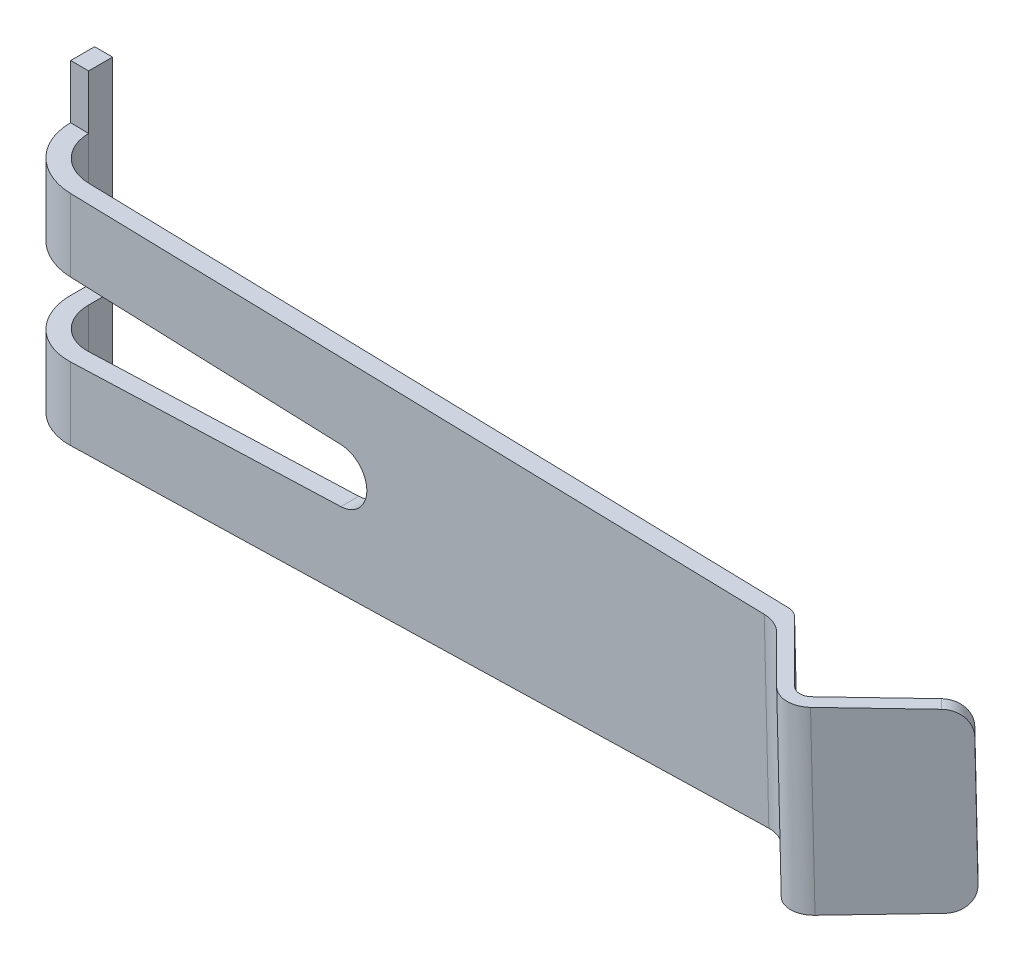
ISO-10303-21;
HEADER;
FILE_DESCRIPTION(('STEP AP214'),'2;1');
FILE_NAME('part.step','',(''),(''),'','','');
FILE_SCHEMA(('AUTOMOTIVE_DESIGN { 1 0 10303 214 1 1 1 1 }'));
ENDSEC;
DATA;
#1=APPLICATION_CONTEXT('core data for automotive mechanical design processes');
#2=APPLICATION_PROTOCOL_DEFINITION('international standard','automotive_design',2000,#1);
#3=PRODUCT_CONTEXT('',#1,'mechanical');
#4=PRODUCT('Part','Part','',(#3));
#5=PRODUCT_RELATED_PRODUCT_CATEGORY('part','',(#4));
#6=PRODUCT_DEFINITION_FORMATION('','',#4);
#7=PRODUCT_DEFINITION_CONTEXT('part definition',#1,'design');
#8=PRODUCT_DEFINITION('design','',#6,#7);
#9=PRODUCT_DEFINITION_SHAPE('','',#8);
#10=(LENGTH_UNIT() NAMED_UNIT(*) SI_UNIT(.MILLI.,.METRE.));
#11=(NAMED_UNIT(*) PLANE_ANGLE_UNIT() SI_UNIT($,.RADIAN.));
#12=(NAMED_UNIT(*) SI_UNIT($,.STERADIAN.) SOLID_ANGLE_UNIT());
#13=UNCERTAINTY_MEASURE_WITH_UNIT(LENGTH_MEASURE(1.E-05),#10,'distance_accuracy_value','');
#14=(GEOMETRIC_REPRESENTATION_CONTEXT(3) GLOBAL_UNCERTAINTY_ASSIGNED_CONTEXT((#13)) GLOBAL_UNIT_ASSIGNED_CONTEXT((#10,
#11,#12)) REPRESENTATION_CONTEXT('',''));
#15=CARTESIAN_POINT('',(0.,0.,0.));
#16=DIRECTION('',(0.,0.,1.));
#17=DIRECTION('',(1.,0.,0.));
#18=AXIS2_PLACEMENT_3D('',#15,#16,#17);
#19=CARTESIAN_POINT('',(13.9270048906,-1.4925760477,2.6));
#20=DIRECTION('',(0.70687896117767,0.0179480986236916,0.70710678118667));
#21=DIRECTION('',(0.707220700364625,0.,-0.706992843652444));
#22=AXIS2_PLACEMENT_3D('',#19,#20,#21);
#23=PLANE('',#22);
#24=DIRECTION('',(0.0253824444800114,-0.999677813854153,-1.24316137737068E-11));
#25=VECTOR('',#24,1.);
#26=CARTESIAN_POINT('',(15.5125589207752,1.06654740280937,0.949999993438799));
#27=LINE('',#26,#25);
#28=CARTESIAN_POINT('',(15.5125589235475,1.06654740273762,0.949999996167849));
#29=VERTEX_POINT('',#28);
#30=CARTESIAN_POINT('',(15.566320301212,-1.05082388886274,0.94999999340209));
#31=VERTEX_POINT('',#30);
#32=EDGE_CURVE('E204',#29,#31,#27,.T.);
#33=ORIENTED_EDGE('',*,*,#32,.F.);
#34=CARTESIAN_POINT('',(15.2298073418484,1.05936816322342,1.23284271137147));
#35=DIRECTION('',(0.70687896117767,0.0179480986236916,0.70710678118667));
#36=DIRECTION('',(-0.0253824444921097,0.999677813853846,-3.29365007489813E-13));
#37=AXIS2_PLACEMENT_3D('',#34,#35,#36);
#38=ELLIPSE('',#37,0.400258123066368,0.4);
#39=CARTESIAN_POINT('',(15.2298007921475,1.45949724551445,1.22269300474117));
#40=VERTEX_POINT('',#39);
#41=EDGE_CURVE('E186',#29,#40,#38,.T.);
#42=ORIENTED_EDGE('',*,*,#41,.T.);
#43=DIRECTION('',(-0.707334527629331,0.0179596657415399,0.706650774024796));
#44=VECTOR('',#43,1.);
#45=CARTESIAN_POINT('',(15.2298007921293,1.45949724551075,1.22269300475935));
#46=LINE('',#45,#44);
#47=CARTESIAN_POINT('',(14.134277508292,1.48731326639073,2.31715728753964));
#48=VERTEX_POINT('',#47);
#49=EDGE_CURVE('E200',#40,#48,#46,.T.);
#50=ORIENTED_EDGE('',*,*,#49,.T.);
#51=DIRECTION('',(-0.0253824444923959,0.999677813853839,0.));
#52=VECTOR('',#51,1.);
#53=CARTESIAN_POINT('',(14.1711551606498,0.0349011114030236,2.31715728754597));
#54=LINE('',#53,#52);
#55=CARTESIAN_POINT('',(14.2097564750353,-1.48539680825124,2.31715728754397));
#56=VERTEX_POINT('',#55);
#57=EDGE_CURVE('E198',#56,#48,#54,.T.);
#58=ORIENTED_EDGE('',*,*,#57,.F.);
#59=DIRECTION('',(0.706878961177974,0.0179480986213415,-0.707106781186425));
#60=VECTOR('',#59,1.);
#61=CARTESIAN_POINT('',(14.2097564750333,-1.48539680824916,2.31715728756328));
#62=LINE('',#61,#60);
#63=CARTESIAN_POINT('',(15.2937216973193,-1.45787425378015,1.23284270861909));
#64=VERTEX_POINT('',#63);
#65=EDGE_CURVE('E187',#56,#64,#62,.T.);
#66=ORIENTED_EDGE('',*,*,#65,.T.);
#67=CARTESIAN_POINT('',(15.2835687167511,-1.05800312830797,1.23284270586628));
#68=DIRECTION('',(-0.70687896117767,-0.0179480986236916,-0.70710678118667));
#69=DIRECTION('',(-0.707220700364625,0.,0.706992843652444));
#70=AXIS2_PLACEMENT_3D('',#67,#68,#69);
#71=CIRCLE('',#70,0.4);
#72=EDGE_CURVE('E28',#64,#31,#71,.F.);
#73=ORIENTED_EDGE('',*,*,#72,.T.);
#74=EDGE_LOOP('',(#33,#42,#50,#58,#66,#73));
#75=FACE_BOUND('',#74,.T.);
#76=ADVANCED_FACE('F25',(#75),#23,.T.);
#77=CARTESIAN_POINT('',(0.15,0.,0.4));
#78=DIRECTION('',(1.,0.,0.));
#79=DIRECTION('',(0.,0.,-1.));
#80=AXIS2_PLACEMENT_3D('',#77,#78,#79);
#81=PLANE('',#80);
#82=DIRECTION('',(0.,0.,-1.));
#83=VECTOR('',#82,1.);
#84=CARTESIAN_POINT('',(0.15,-2.75,0.4));
#85=LINE('',#84,#83);
#86=CARTESIAN_POINT('',(0.15,-2.75000000020556,0.4));
#87=VERTEX_POINT('',#86);
#88=CARTESIAN_POINT('',(0.15,-2.75,0.));
#89=VERTEX_POINT('',#88);
#90=EDGE_CURVE('E212',#87,#89,#85,.T.);
#91=ORIENTED_EDGE('',*,*,#90,.T.);
#92=DIRECTION('',(0.,1.,0.));
#93=VECTOR('',#92,1.);
#94=CARTESIAN_POINT('',(0.15,0.,0.));
#95=LINE('',#94,#93);
#96=CARTESIAN_POINT('',(0.15,-0.639107083902,0.));
#97=VERTEX_POINT('',#96);
#98=EDGE_CURVE('E333',#97,#89,#95,.F.);
#99=ORIENTED_EDGE('',*,*,#98,.F.);
#100=DIRECTION('',(0.,0.,-1.));
#101=VECTOR('',#100,1.);
#102=CARTESIAN_POINT('',(0.15,-0.639107083902,0.4));
#103=LINE('',#102,#101);
#104=CARTESIAN_POINT('',(0.15,-0.639107083987338,0.4));
#105=VERTEX_POINT('',#104);
#106=EDGE_CURVE('E218',#97,#105,#103,.F.);
#107=ORIENTED_EDGE('',*,*,#106,.T.);
#108=DIRECTION('',(0.,1.,0.));
#109=VECTOR('',#108,1.);
#110=CARTESIAN_POINT('',(0.15,0.,0.4));
#111=LINE('',#110,#109);
#112=CARTESIAN_POINT('',(0.15,-1.842382812685,0.4));
#113=VERTEX_POINT('',#112);
#114=EDGE_CURVE('E213',#105,#113,#111,.F.);
#115=ORIENTED_EDGE('',*,*,#114,.T.);
#116=DIRECTION('',(0.,1.,0.));
#117=VECTOR('',#116,1.);
#118=CARTESIAN_POINT('',(0.15,0.,0.4));
#119=LINE('',#118,#117);
#120=EDGE_CURVE('E209',#113,#87,#119,.F.);
#121=ORIENTED_EDGE('',*,*,#120,.T.);
#122=EDGE_LOOP('',(#91,#99,#107,#115,#121));
#123=FACE_BOUND('',#122,.T.);
#124=ADVANCED_FACE('F527',(#123),#81,.T.);
#125=CARTESIAN_POINT('',(13.8884035762,0.0277218719541,2.03431457505));
#126=DIRECTION('',(-0.0253824444923959,0.999677813853839,0.));
#127=DIRECTION('',(-0.999677813853839,-0.0253824444923959,0.));
#128=AXIS2_PLACEMENT_3D('',#125,#126,#127);
#129=CYLINDRICAL_SURFACE('',#128,0.4);
#130=CARTESIAN_POINT('',(13.9270048905663,-1.49257604770066,2.03431457505));
#131=DIRECTION('',(-0.0253824444923959,0.999677813853839,0.));
#132=DIRECTION('',(-0.999677813853839,-0.0253824444923959,0.));
#133=AXIS2_PLACEMENT_3D('',#130,#131,#132);
#134=CIRCLE('',#133,0.4);
#135=CARTESIAN_POINT('',(13.6442533060767,-1.49975528715059,2.31715728754822));
#136=VERTEX_POINT('',#135);
#137=EDGE_CURVE('E208',#136,#56,#134,.T.);
#138=ORIENTED_EDGE('',*,*,#137,.T.);
#139=ORIENTED_EDGE('',*,*,#57,.T.);
#140=CARTESIAN_POINT('',(13.8511611178895,1.49450176849107,2.03431457505));
#141=DIRECTION('',(-0.0253824444923959,-0.999677813853839,0.));
#142=DIRECTION('',(-0.999677813853839,0.0253824444923959,0.));
#143=AXIS2_PLACEMENT_3D('',#140,#141,#142);
#144=ELLIPSE('',#143,0.400516079778605,0.4);
#145=CARTESIAN_POINT('',(13.5680447274763,1.50169027059029,2.31715728754138));
#146=VERTEX_POINT('',#145);
#147=EDGE_CURVE('E298',#48,#146,#144,.T.);
#148=ORIENTED_EDGE('',*,*,#147,.T.);
#149=DIRECTION('',(-0.0253824444899985,0.9996778138539,2.44110551938954E-12));
#150=VECTOR('',#149,1.);
#151=CARTESIAN_POINT('',(13.6442533060792,-1.49975528715053,2.31715728755076));
#152=LINE('',#151,#150);
#153=EDGE_CURVE('E322',#136,#146,#152,.T.);
#154=ORIENTED_EDGE('',*,*,#153,.F.);
#155=EDGE_LOOP('',(#138,#139,#148,#154));
#156=FACE_BOUND('',#155,.T.);
#157=ADVANCED_FACE('F570',(#156),#129,.T.);
#158=CARTESIAN_POINT('',(15.576473279,-1.4506950144,0.949999993414));
#159=DIRECTION('',(0.70687896117767,0.0179480986236916,-0.70710678118667));
#160=DIRECTION('',(-0.707220700364625,0.,-0.706992843652444));
#161=AXIS2_PLACEMENT_3D('',#158,#159,#160);
#162=PLANE('',#161);
#163=DIRECTION('',(0.0253824444888027,-0.99967781385393,3.6376807283113E-12));
#164=VECTOR('',#163,1.);
#165=CARTESIAN_POINT('',(15.3624137876937,1.07035968185984,0.799999999993673));
#166=LINE('',#165,#164);
#167=CARTESIAN_POINT('',(15.3624137877141,1.07035968172011,0.799999999976801));
#168=VERTEX_POINT('',#167);
#169=CARTESIAN_POINT('',(15.4163686357192,-1.05463125536349,0.800000000016964));
#170=VERTEX_POINT('',#169);
#171=EDGE_CURVE('E296',#168,#170,#166,.T.);
#172=ORIENTED_EDGE('',*,*,#171,.F.);
#173=DIRECTION('',(0.707334527629309,-0.017959667064232,0.706650773991201));
#174=VECTOR('',#173,1.);
#175=CARTESIAN_POINT('',(15.3624137876966,1.07035968185991,0.800000000003412));
#176=LINE('',#175,#174);
#177=EDGE_CURVE('E327',#168,#29,#176,.T.);
#178=ORIENTED_EDGE('',*,*,#177,.T.);
#179=ORIENTED_EDGE('',*,*,#32,.T.);
#180=DIRECTION('',(-0.706878961178733,-0.0179480985914525,-0.707106781186425));
#181=VECTOR('',#180,1.);
#182=CARTESIAN_POINT('',(15.5663203012015,-1.05082388885996,0.949999993412468));
#183=LINE('',#182,#181);
#184=EDGE_CURVE('E181',#31,#170,#183,.T.);
#185=ORIENTED_EDGE('',*,*,#184,.T.);
#186=EDGE_LOOP('',(#172,#178,#179,#185));
#187=FACE_BOUND('',#186,.T.);
#188=ADVANCED_FACE('F572',(#187),#162,.T.);
#189=CARTESIAN_POINT('',(0.15,0.,0.));
#190=DIRECTION('',(0.,0.,-1.));
#191=DIRECTION('',(-1.,0.,0.));
#192=AXIS2_PLACEMENT_3D('',#189,#190,#191);
#193=PLANE('',#192);
#194=DIRECTION('',(1.,0.,0.));
#195=VECTOR('',#194,1.);
#196=CARTESIAN_POINT('',(0.,-2.75,0.));
#197=LINE('',#196,#195);
#198=CARTESIAN_POINT('',(-0.15,-2.75,0.));
#199=VERTEX_POINT('',#198);
#200=EDGE_CURVE('E292',#199,#89,#197,.T.);
#201=ORIENTED_EDGE('',*,*,#200,.F.);
#202=DIRECTION('',(0.,1.,0.));
#203=VECTOR('',#202,1.);
#204=CARTESIAN_POINT('',(-0.15,0.,0.));
#205=LINE('',#204,#203);
#206=CARTESIAN_POINT('',(-0.149999999995552,-0.650000000100488,0.));
#207=VERTEX_POINT('',#206);
#208=EDGE_CURVE('E343',#207,#199,#205,.F.);
#209=ORIENTED_EDGE('',*,*,#208,.F.);
#210=DIRECTION('',(0.999341453160611,0.0362858098275111,0.));
#211=VECTOR('',#210,1.);
#212=CARTESIAN_POINT('',(-0.150000000745,-0.650000000373,0.));
#213=LINE('',#212,#211);
#214=EDGE_CURVE('E329',#207,#97,#213,.T.);
#215=ORIENTED_EDGE('',*,*,#214,.T.);
#216=ORIENTED_EDGE('',*,*,#98,.T.);
#217=EDGE_LOOP('',(#201,#209,#215,#216));
#218=FACE_BOUND('',#217,.T.);
#219=ADVANCED_FACE('F530',(#218),#193,.T.);
#220=CARTESIAN_POINT('',(0.15,0.,0.4));
#221=DIRECTION('',(1.,0.,0.));
#222=DIRECTION('',(0.,0.,-1.));
#223=AXIS2_PLACEMENT_3D('',#220,#221,#222);
#224=PLANE('',#223);
#225=DIRECTION('',(0.,1.,0.));
#226=VECTOR('',#225,1.);
#227=CARTESIAN_POINT('',(0.15,0.,0.4));
#228=LINE('',#227,#226);
#229=CARTESIAN_POINT('',(0.15,2.75,0.4));
#230=VERTEX_POINT('',#229);
#231=CARTESIAN_POINT('',(0.150000000000004,1.84238281268508,0.4000000001865));
#232=VERTEX_POINT('',#231);
#233=EDGE_CURVE('E316',#230,#232,#228,.F.);
#234=ORIENTED_EDGE('',*,*,#233,.T.);
#235=DIRECTION('',(0.,1.,0.));
#236=VECTOR('',#235,1.);
#237=CARTESIAN_POINT('',(0.15,0.,0.4));
#238=LINE('',#237,#236);
#239=CARTESIAN_POINT('',(0.15,0.639107083987432,0.4));
#240=VERTEX_POINT('',#239);
#241=EDGE_CURVE('E312',#232,#240,#238,.F.);
#242=ORIENTED_EDGE('',*,*,#241,.T.);
#243=DIRECTION('',(0.,0.,-1.));
#244=VECTOR('',#243,1.);
#245=CARTESIAN_POINT('',(0.15,0.639107083902,0.4));
#246=LINE('',#245,#244);
#247=CARTESIAN_POINT('',(0.15,0.639107083902,0.));
#248=VERTEX_POINT('',#247);
#249=EDGE_CURVE('E336',#240,#248,#246,.T.);
#250=ORIENTED_EDGE('',*,*,#249,.T.);
#251=DIRECTION('',(0.,1.,0.));
#252=VECTOR('',#251,1.);
#253=CARTESIAN_POINT('',(0.15,0.,0.));
#254=LINE('',#253,#252);
#255=CARTESIAN_POINT('',(0.15,2.75,0.));
#256=VERTEX_POINT('',#255);
#257=EDGE_CURVE('E288',#256,#248,#254,.F.);
#258=ORIENTED_EDGE('',*,*,#257,.F.);
#259=DIRECTION('',(0.,0.,-1.));
#260=VECTOR('',#259,1.);
#261=CARTESIAN_POINT('',(0.15,2.75,0.4));
#262=LINE('',#261,#260);
#263=EDGE_CURVE('E321',#256,#230,#262,.F.);
#264=ORIENTED_EDGE('',*,*,#263,.T.);
#265=EDGE_LOOP('',(#234,#242,#250,#258,#264));
#266=FACE_BOUND('',#265,.T.);
#267=ADVANCED_FACE('F501',(#266),#224,.T.);
#268=CARTESIAN_POINT('',(12.7273915139,-1.52303498109,1.4));
#269=DIRECTION('',(-0.70687896117767,-0.0179480986236916,0.70710678118667));
#270=DIRECTION('',(0.707220700364625,0.,0.706992843652444));
#271=AXIS2_PLACEMENT_3D('',#268,#269,#270);
#272=PLANE('',#271);
#273=DIRECTION('',(0.706878961177837,0.0179480986267384,0.707106781186425));
#274=VECTOR('',#273,1.);
#275=CARTESIAN_POINT('',(12.8737909402707,-1.51931780816074,1.54644660943926));
#276=LINE('',#275,#274);
#277=CARTESIAN_POINT('',(12.8737909403074,-1.51931780815981,1.54644660943109));
#278=VERTEX_POINT('',#277);
#279=EDGE_CURVE('E325',#278,#136,#276,.T.);
#280=ORIENTED_EDGE('',*,*,#279,.T.);
#281=ORIENTED_EDGE('',*,*,#153,.T.);
#282=DIRECTION('',(-0.707334527629332,0.0179596657398106,-0.706650774024839));
#283=VECTOR('',#282,1.);
#284=CARTESIAN_POINT('',(13.5680447274719,1.50169027058929,2.31715728755809));
#285=LINE('',#284,#283);
#286=CARTESIAN_POINT('',(12.796588311586,1.52127803115016,1.54644660941991));
#287=VERTEX_POINT('',#286);
#288=EDGE_CURVE('E315',#146,#287,#285,.T.);
#289=ORIENTED_EDGE('',*,*,#288,.T.);
#290=DIRECTION('',(-0.0253824444923959,0.999677813853839,0.));
#291=VECTOR('',#290,1.);
#292=CARTESIAN_POINT('',(12.8349866548929,0.00897404912579365,1.54644660941072));
#293=LINE('',#292,#291);
#294=EDGE_CURVE('E285',#287,#278,#293,.F.);
#295=ORIENTED_EDGE('',*,*,#294,.T.);
#296=EDGE_LOOP('',(#280,#281,#289,#295));
#297=FACE_BOUND('',#296,.T.);
#298=ADVANCED_FACE('F567',(#297),#272,.T.);
#299=CARTESIAN_POINT('',(15.4265216135,-1.45450238091,0.8));
#300=DIRECTION('',(-0.70687896117767,-0.0179480986236916,-0.70710678118667));
#301=DIRECTION('',(-0.707220700364625,0.,0.706992843652444));
#302=AXIS2_PLACEMENT_3D('',#299,#300,#301);
#303=PLANE('',#302);
#304=DIRECTION('',(0.707334527629331,-0.0179596657406386,-0.706650774024818));
#305=VECTOR('',#304,1.);
#306=CARTESIAN_POINT('',(13.9927193130798,1.49090751743949,2.15857864592983));
#307=LINE('',#306,#305);
#308=CARTESIAN_POINT('',(13.9927193130989,1.49090751744022,2.15857864594654));
#309=VERTEX_POINT('',#308);
#310=CARTESIAN_POINT('',(15.0796556535759,1.46330952442342,1.07269300579063));
#311=VERTEX_POINT('',#310);
#312=EDGE_CURVE('E293',#309,#311,#307,.T.);
#313=ORIENTED_EDGE('',*,*,#312,.T.);
#314=CARTESIAN_POINT('',(15.0796622032667,1.06318044213273,1.08284271243109));
#315=DIRECTION('',(-0.70687896117767,-0.0179480986236916,-0.70710678118667));
#316=DIRECTION('',(-0.0253824444921097,0.999677813853846,-3.29365007489813E-13));
#317=AXIS2_PLACEMENT_3D('',#314,#315,#316);
#318=ELLIPSE('',#317,0.400258123066368,0.4);
#319=EDGE_CURVE('E289',#311,#168,#318,.T.);
#320=ORIENTED_EDGE('',*,*,#319,.T.);
#321=ORIENTED_EDGE('',*,*,#171,.T.);
#322=CARTESIAN_POINT('',(15.1336170512888,-1.06181049481386,1.08284271248413));
#323=DIRECTION('',(-0.70687896117767,-0.0179480986236916,-0.70710678118667));
#324=DIRECTION('',(-0.707220700364625,0.,0.706992843652444));
#325=AXIS2_PLACEMENT_3D('',#322,#323,#324);
#326=CIRCLE('',#325,0.4);
#327=CARTESIAN_POINT('',(15.1437700290762,-1.46168162035928,1.08284271246051));
#328=VERTEX_POINT('',#327);
#329=EDGE_CURVE('E294',#170,#328,#326,.T.);
#330=ORIENTED_EDGE('',*,*,#329,.T.);
#331=DIRECTION('',(-0.70687896117793,-0.0179480986230676,0.707106781186425));
#332=VECTOR('',#331,1.);
#333=CARTESIAN_POINT('',(15.1437700290667,-1.46168162036084,1.08284271243672));
#334=LINE('',#333,#332);
#335=CARTESIAN_POINT('',(14.0683806828009,-1.48898642797978,2.15857864594061));
#336=VERTEX_POINT('',#335);
#337=EDGE_CURVE('E192',#328,#336,#334,.T.);
#338=ORIENTED_EDGE('',*,*,#337,.T.);
#339=DIRECTION('',(-0.0253824444923959,0.999677813853839,0.));
#340=VECTOR('',#339,1.);
#341=CARTESIAN_POINT('',(14.0297321473252,0.03317127717487,2.15857864595767));
#342=LINE('',#341,#340);
#343=EDGE_CURVE('E279',#336,#309,#342,.T.);
#344=ORIENTED_EDGE('',*,*,#343,.T.);
#345=EDGE_LOOP('',(#313,#320,#321,#330,#338,#344));
#346=FACE_BOUND('',#345,.T.);
#347=ADVANCED_FACE('F640',(#346),#303,.T.);
#348=CARTESIAN_POINT('',(0.,-2.75,0.2));
#349=DIRECTION('',(0.,-1.,0.));
#350=DIRECTION('',(0.,0.,-1.));
#351=AXIS2_PLACEMENT_3D('',#348,#349,#350);
#352=PLANE('',#351);
#353=ORIENTED_EDGE('',*,*,#90,.F.);
#354=DIRECTION('',(1.,0.,0.));
#355=VECTOR('',#354,1.);
#356=CARTESIAN_POINT('',(0.15,-2.75000000037,0.4));
#357=LINE('',#356,#355);
#358=CARTESIAN_POINT('',(-0.15,-2.75000000024667,0.4));
#359=VERTEX_POINT('',#358);
#360=EDGE_CURVE('E275',#359,#87,#357,.T.);
#361=ORIENTED_EDGE('',*,*,#360,.F.);
#362=DIRECTION('',(0.,0.,1.));
#363=VECTOR('',#362,1.);
#364=CARTESIAN_POINT('',(-0.15,-2.75,0.));
#365=LINE('',#364,#363);
#366=EDGE_CURVE('E346',#199,#359,#365,.T.);
#367=ORIENTED_EDGE('',*,*,#366,.F.);
#368=ORIENTED_EDGE('',*,*,#200,.T.);
#369=EDGE_LOOP('',(#353,#361,#367,#368));
#370=FACE_BOUND('',#369,.T.);
#371=ADVANCED_FACE('F550',(#370),#352,.T.);
#372=CARTESIAN_POINT('',(-0.15,0.,0.));
#373=DIRECTION('',(-1.,0.,0.));
#374=DIRECTION('',(0.,0.,1.));
#375=AXIS2_PLACEMENT_3D('',#372,#373,#374);
#376=PLANE('',#375);
#377=DIRECTION('',(0.,1.,0.));
#378=VECTOR('',#377,1.);
#379=CARTESIAN_POINT('',(-0.15,-1.85,0.4));
#380=LINE('',#379,#378);
#381=CARTESIAN_POINT('',(-0.15,-1.85,0.4));
#382=VERTEX_POINT('',#381);
#383=EDGE_CURVE('E278',#382,#359,#380,.F.);
#384=ORIENTED_EDGE('',*,*,#383,.F.);
#385=DIRECTION('',(0.,1.,0.));
#386=VECTOR('',#385,1.);
#387=CARTESIAN_POINT('',(-0.15,0.,0.4));
#388=LINE('',#387,#386);
#389=CARTESIAN_POINT('',(-0.15,-0.649999999988906,0.4));
#390=VERTEX_POINT('',#389);
#391=EDGE_CURVE('E274',#390,#382,#388,.F.);
#392=ORIENTED_EDGE('',*,*,#391,.F.);
#393=DIRECTION('',(0.,0.,1.));
#394=VECTOR('',#393,1.);
#395=CARTESIAN_POINT('',(-0.15,-0.649999999978,0.));
#396=LINE('',#395,#394);
#397=EDGE_CURVE('E347',#390,#207,#396,.F.);
#398=ORIENTED_EDGE('',*,*,#397,.T.);
#399=ORIENTED_EDGE('',*,*,#208,.T.);
#400=ORIENTED_EDGE('',*,*,#366,.T.);
#401=EDGE_LOOP('',(#384,#392,#398,#399,#400));
#402=FACE_BOUND('',#401,.T.);
#403=ADVANCED_FACE('F534',(#402),#376,.T.);
#404=CARTESIAN_POINT('',(0.15,0.,0.));
#405=DIRECTION('',(0.,0.,-1.));
#406=DIRECTION('',(-1.,0.,0.));
#407=AXIS2_PLACEMENT_3D('',#404,#405,#406);
#408=PLANE('',#407);
#409=DIRECTION('',(1.,0.,0.));
#410=VECTOR('',#409,1.);
#411=CARTESIAN_POINT('',(0.,2.75,0.));
#412=LINE('',#411,#410);
#413=CARTESIAN_POINT('',(-0.15,2.75,0.));
#414=VERTEX_POINT('',#413);
#415=EDGE_CURVE('E282',#414,#256,#412,.T.);
#416=ORIENTED_EDGE('',*,*,#415,.T.);
#417=ORIENTED_EDGE('',*,*,#257,.T.);
#418=DIRECTION('',(-0.999341453160611,0.0362858098275111,0.));
#419=VECTOR('',#418,1.);
#420=CARTESIAN_POINT('',(0.15,0.639107083902,0.));
#421=LINE('',#420,#419);
#422=CARTESIAN_POINT('',(-0.150000000500848,0.650000000142671,0.));
#423=VERTEX_POINT('',#422);
#424=EDGE_CURVE('E370',#248,#423,#421,.T.);
#425=ORIENTED_EDGE('',*,*,#424,.T.);
#426=DIRECTION('',(0.,1.,0.));
#427=VECTOR('',#426,1.);
#428=CARTESIAN_POINT('',(-0.15,0.,0.));
#429=LINE('',#428,#427);
#430=EDGE_CURVE('E270',#414,#423,#429,.F.);
#431=ORIENTED_EDGE('',*,*,#430,.F.);
#432=EDGE_LOOP('',(#416,#417,#425,#431));
#433=FACE_BOUND('',#432,.T.);
#434=ADVANCED_FACE('F632',(#433),#408,.T.);
#435=CARTESIAN_POINT('',(12.4815471743,-1.86139992309E-10,1.9));
#436=DIRECTION('',(-0.0253824444923959,0.999677813853839,0.));
#437=DIRECTION('',(-0.999677813853839,-0.0253824444923959,0.));
#438=AXIS2_PLACEMENT_3D('',#435,#436,#437);
#439=CYLINDRICAL_SURFACE('',#438,0.5);
#440=CARTESIAN_POINT('',(12.4426928235841,1.53026365877619,1.9));
#441=DIRECTION('',(-0.0253824444923959,-0.999677813853839,0.));
#442=DIRECTION('',(-0.999677813853839,0.0253824444923959,0.));
#443=AXIS2_PLACEMENT_3D('',#440,#441,#442);
#444=ELLIPSE('',#443,0.500645099723257,0.5);
#445=CARTESIAN_POINT('',(12.4426928231921,1.53026365878614,1.4));
#446=VERTEX_POINT('',#445);
#447=EDGE_CURVE('E283',#446,#287,#444,.T.);
#448=ORIENTED_EDGE('',*,*,#447,.F.);
#449=DIRECTION('',(-0.0253824446703039,0.999677813849322,0.));
#450=VECTOR('',#449,1.);
#451=CARTESIAN_POINT('',(12.5203514595,-1.52829185747,1.4));
#452=LINE('',#451,#450);
#453=CARTESIAN_POINT('',(12.5203514596195,-1.52829185747229,1.4));
#454=VERTEX_POINT('',#453);
#455=EDGE_CURVE('E269',#454,#446,#452,.T.);
#456=ORIENTED_EDGE('',*,*,#455,.F.);
#457=CARTESIAN_POINT('',(12.5203514597389,-1.52829185747113,1.9));
#458=DIRECTION('',(-0.0253824444923959,0.999677813853839,0.));
#459=DIRECTION('',(-0.999677813853839,-0.0253824444923959,0.));
#460=AXIS2_PLACEMENT_3D('',#457,#458,#459);
#461=CIRCLE('',#460,0.5);
#462=EDGE_CURVE('E286',#278,#454,#461,.T.);
#463=ORIENTED_EDGE('',*,*,#462,.F.);
#464=ORIENTED_EDGE('',*,*,#294,.F.);
#465=EDGE_LOOP('',(#448,#456,#463,#464));
#466=FACE_BOUND('',#465,.T.);
#467=ADVANCED_FACE('F564',(#466),#439,.F.);
#468=CARTESIAN_POINT('',(0.,2.75,0.2));
#469=DIRECTION('',(0.,-1.,0.));
#470=DIRECTION('',(0.,0.,-1.));
#471=AXIS2_PLACEMENT_3D('',#468,#469,#470);
#472=PLANE('',#471);
#473=DIRECTION('',(-1.,0.,0.));
#474=VECTOR('',#473,1.);
#475=CARTESIAN_POINT('',(0.15,2.75,0.4));
#476=LINE('',#475,#474);
#477=CARTESIAN_POINT('',(-0.15,2.75,0.4));
#478=VERTEX_POINT('',#477);
#479=EDGE_CURVE('E400',#478,#230,#476,.F.);
#480=ORIENTED_EDGE('',*,*,#479,.T.);
#481=ORIENTED_EDGE('',*,*,#263,.F.);
#482=ORIENTED_EDGE('',*,*,#415,.F.);
#483=DIRECTION('',(0.,0.,1.));
#484=VECTOR('',#483,1.);
#485=CARTESIAN_POINT('',(-0.15,2.75,0.));
#486=LINE('',#485,#484);
#487=EDGE_CURVE('E406',#478,#414,#486,.F.);
#488=ORIENTED_EDGE('',*,*,#487,.F.);
#489=EDGE_LOOP('',(#480,#481,#482,#488));
#490=FACE_BOUND('',#489,.T.);
#491=ADVANCED_FACE('F507',(#490),#472,.F.);
#492=CARTESIAN_POINT('',(13.8883563551,0.0295816574504,2.01715728971));
#493=DIRECTION('',(-0.0253824444923959,0.999677813853839,0.));
#494=DIRECTION('',(-0.999677813853839,-0.0253824444923959,0.));
#495=AXIS2_PLACEMENT_3D('',#492,#493,#494);
#496=CYLINDRICAL_SURFACE('',#495,0.2);
#497=CARTESIAN_POINT('',(13.8511611179056,1.49450176849066,2.01715728971));
#498=DIRECTION('',(-0.0253824444923959,-0.999677813853839,0.));
#499=DIRECTION('',(-0.999677813853839,0.0253824444923959,0.));
#500=AXIS2_PLACEMENT_3D('',#497,#498,#499);
#501=ELLIPSE('',#500,0.200258039889303,0.2);
#502=CARTESIAN_POINT('',(13.7096029227035,1.49809601954072,2.15857864594363));
#503=VERTEX_POINT('',#502);
#504=EDGE_CURVE('E276',#309,#503,#501,.T.);
#505=ORIENTED_EDGE('',*,*,#504,.F.);
#506=ORIENTED_EDGE('',*,*,#343,.F.);
#507=CARTESIAN_POINT('',(13.9270048905825,-1.49257604770408,2.01715728971));
#508=DIRECTION('',(-0.0253824444923959,0.999677813853839,0.));
#509=DIRECTION('',(-0.999677813853839,-0.0253824444923959,0.));
#510=AXIS2_PLACEMENT_3D('',#507,#508,#509);
#511=CIRCLE('',#510,0.2);
#512=CARTESIAN_POINT('',(13.7856290983184,-1.49616566742743,2.15857864595297));
#513=VERTEX_POINT('',#512);
#514=EDGE_CURVE('E280',#513,#336,#511,.T.);
#515=ORIENTED_EDGE('',*,*,#514,.F.);
#516=DIRECTION('',(0.0253824444847826,-0.999677813854032,-7.65884705445948E-12));
#517=VECTOR('',#516,1.);
#518=CARTESIAN_POINT('',(13.709602922708,1.4980960195402,2.15857864594203));
#519=LINE('',#518,#517);
#520=EDGE_CURVE('E403',#503,#513,#519,.T.);
#521=ORIENTED_EDGE('',*,*,#520,.F.);
#522=EDGE_LOOP('',(#505,#506,#515,#521));
#523=FACE_BOUND('',#522,.T.);
#524=ADVANCED_FACE('F624',(#523),#496,.F.);
#525=CARTESIAN_POINT('',(0.15,-1.85,0.4));
#526=DIRECTION('',(0.,0.,1.));
#527=DIRECTION('',(1.,0.,0.));
#528=AXIS2_PLACEMENT_3D('',#525,#526,#527);
#529=PLANE('',#528);
#530=ORIENTED_EDGE('',*,*,#120,.F.);
#531=DIRECTION('',(-0.999677813853839,-0.0253824444923959,0.));
#532=VECTOR('',#531,1.);
#533=CARTESIAN_POINT('',(-0.15,-1.85,0.4));
#534=LINE('',#533,#532);
#535=EDGE_CURVE('E260',#113,#382,#534,.T.);
#536=ORIENTED_EDGE('',*,*,#535,.T.);
#537=ORIENTED_EDGE('',*,*,#383,.T.);
#538=ORIENTED_EDGE('',*,*,#360,.T.);
#539=EDGE_LOOP('',(#530,#536,#537,#538));
#540=FACE_BOUND('',#539,.T.);
#541=ADVANCED_FACE('F547',(#540),#529,.T.);
#542=CARTESIAN_POINT('',(0.85,0.,0.4));
#543=DIRECTION('',(0.,1.,0.));
#544=DIRECTION('',(0.,0.,1.));
#545=AXIS2_PLACEMENT_3D('',#542,#543,#544);
#546=CYLINDRICAL_SURFACE('',#545,1.);
#547=CARTESIAN_POINT('',(0.85,-1.82460937499999,0.4));
#548=DIRECTION('',(-0.0253824444923959,0.999677813853839,0.));
#549=DIRECTION('',(0.999677813853839,0.0253824444923959,0.));
#550=AXIS2_PLACEMENT_3D('',#547,#548,#549);
#551=ELLIPSE('',#550,1.00032228998353,1.);
#552=CARTESIAN_POINT('',(0.8499999997555,-1.82460937500619,1.4));
#553=VERTEX_POINT('',#552);
#554=EDGE_CURVE('E258',#382,#553,#551,.T.);
#555=ORIENTED_EDGE('',*,*,#554,.T.);
#556=DIRECTION('',(0.,1.,0.));
#557=VECTOR('',#556,1.);
#558=CARTESIAN_POINT('',(0.849999999511,0.,1.4));
#559=LINE('',#558,#557);
#560=CARTESIAN_POINT('',(0.8499999997555,-0.613690280251571,1.4));
#561=VERTEX_POINT('',#560);
#562=EDGE_CURVE('E266',#561,#553,#559,.F.);
#563=ORIENTED_EDGE('',*,*,#562,.F.);
#564=CARTESIAN_POINT('',(0.85,-0.613690280242693,0.4));
#565=DIRECTION('',(0.0362858081082014,-0.999341453223039,0.));
#566=DIRECTION('',(0.999341453223039,0.0362858081082014,0.));
#567=AXIS2_PLACEMENT_3D('',#564,#565,#566);
#568=ELLIPSE('',#567,1.00065898074661,1.);
#569=EDGE_CURVE('E271',#561,#390,#568,.T.);
#570=ORIENTED_EDGE('',*,*,#569,.T.);
#571=ORIENTED_EDGE('',*,*,#391,.T.);
#572=EDGE_LOOP('',(#555,#563,#570,#571));
#573=FACE_BOUND('',#572,.T.);
#574=ADVANCED_FACE('F538',(#573),#546,.T.);
#575=CARTESIAN_POINT('',(15.4678239148,-1.05332477367,1.41715728752));
#576=DIRECTION('',(-0.70687896117767,-0.0179480986236916,-0.70710678118667));
#577=DIRECTION('',(-0.707220700364625,0.,0.706992843652444));
#578=AXIS2_PLACEMENT_3D('',#575,#576,#577);
#579=CYLINDRICAL_SURFACE('',#578,0.4);
#580=ORIENTED_EDGE('',*,*,#329,.F.);
#581=ORIENTED_EDGE('',*,*,#184,.F.);
#582=ORIENTED_EDGE('',*,*,#72,.F.);
#583=DIRECTION('',(-0.70687896120528,-0.0179480986243628,-0.707106781159051));
#584=VECTOR('',#583,1.);
#585=CARTESIAN_POINT('',(15.2937217001,-1.45787425370819,1.23284271138));
#586=LINE('',#585,#584);
#587=EDGE_CURVE('E179',#64,#328,#586,.T.);
#588=ORIENTED_EDGE('',*,*,#587,.T.);
#589=EDGE_LOOP('',(#580,#581,#582,#588));
#590=FACE_BOUND('',#589,.T.);
#591=ADVANCED_FACE('F178',(#590),#579,.T.);
#592=CARTESIAN_POINT('',(-0.15,0.,0.));
#593=DIRECTION('',(-1.,0.,0.));
#594=DIRECTION('',(0.,0.,1.));
#595=AXIS2_PLACEMENT_3D('',#592,#593,#594);
#596=PLANE('',#595);
#597=ORIENTED_EDGE('',*,*,#487,.T.);
#598=ORIENTED_EDGE('',*,*,#430,.T.);
#599=DIRECTION('',(0.,0.,1.));
#600=VECTOR('',#599,1.);
#601=CARTESIAN_POINT('',(-0.150000000757545,0.650000000027506,1.4));
#602=LINE('',#601,#600);
#603=CARTESIAN_POINT('',(-0.150000000189386,0.650000000013753,0.4000000001865));
#604=VERTEX_POINT('',#603);
#605=EDGE_CURVE('E250',#423,#604,#602,.T.);
#606=ORIENTED_EDGE('',*,*,#605,.T.);
#607=DIRECTION('',(0.,1.,0.));
#608=VECTOR('',#607,1.);
#609=CARTESIAN_POINT('',(-0.15,0.,0.400000000372999));
#610=LINE('',#609,#608);
#611=CARTESIAN_POINT('',(-0.15,1.84999999981508,0.4000000001865));
#612=VERTEX_POINT('',#611);
#613=EDGE_CURVE('E265',#612,#604,#610,.F.);
#614=ORIENTED_EDGE('',*,*,#613,.F.);
#615=DIRECTION('',(0.,1.,0.));
#616=VECTOR('',#615,1.);
#617=CARTESIAN_POINT('',(-0.15,1.85,0.4));
#618=LINE('',#617,#616);
#619=EDGE_CURVE('E264',#612,#478,#618,.T.);
#620=ORIENTED_EDGE('',*,*,#619,.T.);
#621=EDGE_LOOP('',(#597,#598,#606,#614,#620));
#622=FACE_BOUND('',#621,.T.);
#623=ADVANCED_FACE('F556',(#622),#596,.T.);
#624=CARTESIAN_POINT('',(0.85,0.,1.4));
#625=DIRECTION('',(0.,0.,1.));
#626=DIRECTION('',(1.,0.,0.));
#627=AXIS2_PLACEMENT_3D('',#624,#625,#626);
#628=PLANE('',#627);
#629=DIRECTION('',(-0.999677813853839,-0.0253824444923959,0.));
#630=VECTOR('',#629,1.);
#631=CARTESIAN_POINT('',(-0.15,-1.85,1.4));
#632=LINE('',#631,#630);
#633=EDGE_CURVE('E194',#553,#454,#632,.F.);
#634=ORIENTED_EDGE('',*,*,#633,.T.);
#635=ORIENTED_EDGE('',*,*,#455,.T.);
#636=DIRECTION('',(0.999677813853839,-0.0253824444923959,0.));
#637=VECTOR('',#636,1.);
#638=CARTESIAN_POINT('',(12.65,1.525,1.4));
#639=LINE('',#638,#637);
#640=CARTESIAN_POINT('',(0.8500000003585,1.82460937499105,1.4));
#641=VERTEX_POINT('',#640);
#642=EDGE_CURVE('E244',#446,#641,#639,.F.);
#643=ORIENTED_EDGE('',*,*,#642,.T.);
#644=DIRECTION('',(0.,1.,0.));
#645=VECTOR('',#644,1.);
#646=CARTESIAN_POINT('',(0.850000000717,0.,1.4));
#647=LINE('',#646,#645);
#648=CARTESIAN_POINT('',(0.8500000003585,0.613690280229863,1.4));
#649=VERTEX_POINT('',#648);
#650=EDGE_CURVE('E261',#649,#641,#647,.T.);
#651=ORIENTED_EDGE('',*,*,#650,.F.);
#652=DIRECTION('',(-0.999341453223039,0.0362858081082014,0.));
#653=VECTOR('',#652,1.);
#654=CARTESIAN_POINT('',(-0.15,0.65,1.4));
#655=LINE('',#654,#653);
#656=CARTESIAN_POINT('',(5.36632861364935,0.449703653950211,1.4));
#657=VERTEX_POINT('',#656);
#658=EDGE_CURVE('E446',#649,#657,#655,.F.);
#659=ORIENTED_EDGE('',*,*,#658,.T.);
#660=CARTESIAN_POINT('',(5.35,0.,1.4));
#661=DIRECTION('',(0.,0.,-1.));
#662=DIRECTION('',(-1.,0.,0.));
#663=AXIS2_PLACEMENT_3D('',#660,#661,#662);
#664=CIRCLE('',#663,0.45);
#665=CARTESIAN_POINT('',(5.36632861364934,-0.449703653950184,1.4));
#666=VERTEX_POINT('',#665);
#667=EDGE_CURVE('E251',#657,#666,#664,.T.);
#668=ORIENTED_EDGE('',*,*,#667,.T.);
#669=DIRECTION('',(0.999341453223039,0.0362858081082014,0.));
#670=VECTOR('',#669,1.);
#671=CARTESIAN_POINT('',(5.36632861365,-0.44970365395,1.4));
#672=LINE('',#671,#670);
#673=EDGE_CURVE('E254',#666,#561,#672,.F.);
#674=ORIENTED_EDGE('',*,*,#673,.T.);
#675=ORIENTED_EDGE('',*,*,#562,.T.);
#676=EDGE_LOOP('',(#634,#635,#643,#651,#659,#668,#674,#675));
#677=FACE_BOUND('',#676,.T.);
#678=ADVANCED_FACE('F542',(#677),#628,.T.);
#679=CARTESIAN_POINT('',(0.85,0.,0.4));
#680=DIRECTION('',(0.,1.,0.));
#681=DIRECTION('',(0.,0.,1.));
#682=AXIS2_PLACEMENT_3D('',#679,#680,#681);
#683=CYLINDRICAL_SURFACE('',#682,1.);
#684=CARTESIAN_POINT('',(0.85,0.61369028024288,0.4));
#685=DIRECTION('',(0.0362858081082014,0.999341453223039,0.));
#686=DIRECTION('',(-0.999341453223039,0.0362858081082014,0.));
#687=AXIS2_PLACEMENT_3D('',#684,#685,#686);
#688=ELLIPSE('',#687,1.00065898074661,1.);
#689=EDGE_CURVE('E247',#604,#649,#688,.T.);
#690=ORIENTED_EDGE('',*,*,#689,.T.);
#691=ORIENTED_EDGE('',*,*,#650,.T.);
#692=CARTESIAN_POINT('',(0.85,1.82460937500016,0.4));
#693=DIRECTION('',(-0.0253824444923959,-0.999677813853839,0.));
#694=DIRECTION('',(-0.999677813853839,0.0253824444923959,0.));
#695=AXIS2_PLACEMENT_3D('',#692,#693,#694);
#696=ELLIPSE('',#695,1.00032228998353,1.);
#697=EDGE_CURVE('E241',#641,#612,#696,.T.);
#698=ORIENTED_EDGE('',*,*,#697,.T.);
#699=ORIENTED_EDGE('',*,*,#613,.T.);
#700=EDGE_LOOP('',(#690,#691,#698,#699));
#701=FACE_BOUND('',#700,.T.);
#702=ADVANCED_FACE('F559',(#701),#683,.T.);
#703=CARTESIAN_POINT('',(0.15,1.85,0.4));
#704=DIRECTION('',(0.,0.,-1.));
#705=DIRECTION('',(-1.,0.,0.));
#706=AXIS2_PLACEMENT_3D('',#703,#704,#705);
#707=PLANE('',#706);
#708=ORIENTED_EDGE('',*,*,#479,.F.);
#709=ORIENTED_EDGE('',*,*,#619,.F.);
#710=DIRECTION('',(0.999677813853839,-0.0253824444923959,0.));
#711=VECTOR('',#710,1.);
#712=CARTESIAN_POINT('',(12.65,1.525,0.400000000373));
#713=LINE('',#712,#711);
#714=EDGE_CURVE('E240',#612,#232,#713,.T.);
#715=ORIENTED_EDGE('',*,*,#714,.T.);
#716=ORIENTED_EDGE('',*,*,#233,.F.);
#717=EDGE_LOOP('',(#708,#709,#715,#716));
#718=FACE_BOUND('',#717,.T.);
#719=ADVANCED_FACE('F499',(#718),#707,.F.);
#720=CARTESIAN_POINT('',(15.4172864001,1.05460795276,1.42014054069));
#721=DIRECTION('',(-0.707334527629076,0.0179596657406019,-0.706650774025076));
#722=DIRECTION('',(-0.706764766561961,0.,0.707448630464868));
#723=AXIS2_PLACEMENT_3D('',#720,#721,#722);
#724=CYLINDRICAL_SURFACE('',#723,0.4);
#725=ORIENTED_EDGE('',*,*,#41,.F.);
#726=ORIENTED_EDGE('',*,*,#177,.F.);
#727=ORIENTED_EDGE('',*,*,#319,.F.);
#728=DIRECTION('',(0.707334527532152,-0.0179596657381303,0.706650774122155));
#729=VECTOR('',#728,1.);
#730=CARTESIAN_POINT('',(15.0796556536,1.46330952442028,1.07269300583));
#731=LINE('',#730,#729);
#732=EDGE_CURVE('E236',#311,#40,#731,.T.);
#733=ORIENTED_EDGE('',*,*,#732,.T.);
#734=EDGE_LOOP('',(#725,#726,#727,#733));
#735=FACE_BOUND('',#734,.T.);
#736=ADVANCED_FACE('F606',(#735),#724,.T.);
#737=CARTESIAN_POINT('',(13.9270048906,-1.4925760477,2.30000000219));
#738=DIRECTION('',(0.70687896117767,0.0179480986236916,-0.70710678118667));
#739=DIRECTION('',(-0.707220700364625,0.,-0.706992843652444));
#740=AXIS2_PLACEMENT_3D('',#737,#738,#739);
#741=PLANE('',#740);
#742=DIRECTION('',(0.707334527618795,-0.0179596657403304,0.706650774035373));
#743=VECTOR('',#742,1.);
#744=CARTESIAN_POINT('',(12.723294154,1.52313901562109,1.1732233047));
#745=LINE('',#744,#743);
#746=CARTESIAN_POINT('',(12.7232941539923,1.52313901562118,1.1732233047051));
#747=VERTEX_POINT('',#746);
#748=EDGE_CURVE('E239',#747,#503,#745,.T.);
#749=ORIENTED_EDGE('',*,*,#748,.T.);
#750=ORIENTED_EDGE('',*,*,#520,.T.);
#751=DIRECTION('',(-0.706878961174164,-0.0179480986235721,-0.707106781190178));
#752=VECTOR('',#751,1.);
#753=CARTESIAN_POINT('',(13.7856290982999,-1.49616566742579,2.15857864595));
#754=LINE('',#753,#752);
#755=CARTESIAN_POINT('',(12.8005912249421,-1.52117639467893,1.1732233047183));
#756=VERTEX_POINT('',#755);
#757=EDGE_CURVE('E429',#513,#756,#754,.T.);
#758=ORIENTED_EDGE('',*,*,#757,.T.);
#759=DIRECTION('',(-0.0253824444923959,0.999677813853839,0.));
#760=VECTOR('',#759,1.);
#761=CARTESIAN_POINT('',(12.7618536771996,0.00448702465604649,1.1732233047085));
#762=LINE('',#761,#760);
#763=EDGE_CURVE('E234',#747,#756,#762,.F.);
#764=ORIENTED_EDGE('',*,*,#763,.F.);
#765=EDGE_LOOP('',(#749,#750,#758,#764));
#766=FACE_BOUND('',#765,.T.);
#767=ADVANCED_FACE('F603',(#766),#741,.T.);
#768=CARTESIAN_POINT('',(-0.15,-1.85,1.4));
#769=DIRECTION('',(-0.0253824444923959,0.999677813853839,0.));
#770=DIRECTION('',(-0.999677813853839,-0.0253824444923959,0.));
#771=AXIS2_PLACEMENT_3D('',#768,#769,#770);
#772=PLANE('',#771);
#773=ORIENTED_EDGE('',*,*,#65,.F.);
#774=ORIENTED_EDGE('',*,*,#137,.F.);
#775=ORIENTED_EDGE('',*,*,#279,.F.);
#776=ORIENTED_EDGE('',*,*,#462,.T.);
#777=ORIENTED_EDGE('',*,*,#633,.F.);
#778=ORIENTED_EDGE('',*,*,#554,.F.);
#779=ORIENTED_EDGE('',*,*,#535,.F.);
#780=CARTESIAN_POINT('',(0.85,-1.82460937499999,0.4));
#781=DIRECTION('',(-0.0253824444923959,0.999677813853839,0.));
#782=DIRECTION('',(0.999677813853839,0.0253824444923959,0.));
#783=AXIS2_PLACEMENT_3D('',#780,#781,#782);
#784=ELLIPSE('',#783,0.70022560298847,0.7);
#785=CARTESIAN_POINT('',(0.8499999998905,-1.82460937500499,1.1));
#786=VERTEX_POINT('',#785);
#787=EDGE_CURVE('E193',#113,#786,#784,.T.);
#788=ORIENTED_EDGE('',*,*,#787,.T.);
#789=DIRECTION('',(-0.999677813853833,-0.0253824444926367,0.));
#790=VECTOR('',#789,1.);
#791=CARTESIAN_POINT('',(12.6238714853,-1.52566341932,1.1));
#792=LINE('',#791,#790);
#793=CARTESIAN_POINT('',(12.6238714849783,-1.52566341932731,1.1));
#794=VERTEX_POINT('',#793);
#795=EDGE_CURVE('E230',#794,#786,#792,.T.);
#796=ORIENTED_EDGE('',*,*,#795,.F.);
#797=CARTESIAN_POINT('',(12.6238714846566,-1.52566341933462,1.35));
#798=DIRECTION('',(-0.0253824444923959,0.999677813853839,0.));
#799=DIRECTION('',(-0.999677813853839,-0.0253824444923959,0.));
#800=AXIS2_PLACEMENT_3D('',#797,#798,#799);
#801=CIRCLE('',#800,0.25);
#802=EDGE_CURVE('E231',#756,#794,#801,.T.);
#803=ORIENTED_EDGE('',*,*,#802,.F.);
#804=ORIENTED_EDGE('',*,*,#757,.F.);
#805=ORIENTED_EDGE('',*,*,#514,.T.);
#806=ORIENTED_EDGE('',*,*,#337,.F.);
#807=ORIENTED_EDGE('',*,*,#587,.F.);
#808=EDGE_LOOP('',(#773,#774,#775,#776,#777,#778,#779,#788,#796,#803,#804,#805,#806,#807));
#809=FACE_BOUND('',#808,.T.);
#810=ADVANCED_FACE('F189',(#809),#772,.F.);
#811=CARTESIAN_POINT('',(0.85,0.,0.4));
#812=DIRECTION('',(0.,1.,0.));
#813=DIRECTION('',(0.,0.,1.));
#814=AXIS2_PLACEMENT_3D('',#811,#812,#813);
#815=CYLINDRICAL_SURFACE('',#814,0.7);
#816=DIRECTION('',(0.,1.,0.));
#817=VECTOR('',#816,1.);
#818=CARTESIAN_POINT('',(0.849999999781,0.,1.1));
#819=LINE('',#818,#817);
#820=CARTESIAN_POINT('',(0.8499999998905,-0.613690280246945,1.1));
#821=VERTEX_POINT('',#820);
#822=EDGE_CURVE('E227',#786,#821,#819,.T.);
#823=ORIENTED_EDGE('',*,*,#822,.F.);
#824=ORIENTED_EDGE('',*,*,#787,.F.);
#825=ORIENTED_EDGE('',*,*,#114,.F.);
#826=CARTESIAN_POINT('',(0.85,-0.613690280242693,0.4));
#827=DIRECTION('',(0.0362858081082014,-0.999341453223039,0.));
#828=DIRECTION('',(0.999341453223039,0.0362858081082014,0.));
#829=AXIS2_PLACEMENT_3D('',#826,#827,#828);
#830=ELLIPSE('',#829,0.700461286522626,0.7);
#831=EDGE_CURVE('E255',#105,#821,#830,.F.);
#832=ORIENTED_EDGE('',*,*,#831,.T.);
#833=EDGE_LOOP('',(#823,#824,#825,#832));
#834=FACE_BOUND('',#833,.T.);
#835=ADVANCED_FACE('F545',(#834),#815,.F.);
#836=CARTESIAN_POINT('',(5.36632861365,-0.44970365395,1.4));
#837=DIRECTION('',(0.0362858081082014,-0.999341453223039,0.));
#838=DIRECTION('',(0.999341453223039,0.0362858081082014,0.));
#839=AXIS2_PLACEMENT_3D('',#836,#837,#838);
#840=PLANE('',#839);
#841=ORIENTED_EDGE('',*,*,#673,.F.);
#842=DIRECTION('',(0.,0.,-1.));
#843=VECTOR('',#842,1.);
#844=CARTESIAN_POINT('',(5.36632861365001,-0.449703653950319,1.4));
#845=LINE('',#844,#843);
#846=CARTESIAN_POINT('',(5.36632861364937,-0.449703653950103,1.099999999625));
#847=VERTEX_POINT('',#846);
#848=EDGE_CURVE('E253',#666,#847,#845,.T.);
#849=ORIENTED_EDGE('',*,*,#848,.T.);
#850=DIRECTION('',(0.999341453223034,0.0362858081083233,0.));
#851=VECTOR('',#850,1.);
#852=CARTESIAN_POINT('',(0.849999999511001,-0.613690280261,1.1));
#853=LINE('',#852,#851);
#854=EDGE_CURVE('E226',#821,#847,#853,.T.);
#855=ORIENTED_EDGE('',*,*,#854,.F.);
#856=ORIENTED_EDGE('',*,*,#831,.F.);
#857=ORIENTED_EDGE('',*,*,#106,.F.);
#858=ORIENTED_EDGE('',*,*,#214,.F.);
#859=ORIENTED_EDGE('',*,*,#397,.F.);
#860=ORIENTED_EDGE('',*,*,#569,.F.);
#861=EDGE_LOOP('',(#841,#849,#855,#856,#857,#858,#859,#860));
#862=FACE_BOUND('',#861,.T.);
#863=ADVANCED_FACE('F524',(#862),#840,.F.);
#864=CARTESIAN_POINT('',(5.35,0.,1.4));
#865=DIRECTION('',(0.,0.,-1.));
#866=DIRECTION('',(-1.,0.,0.));
#867=AXIS2_PLACEMENT_3D('',#864,#865,#866);
#868=CYLINDRICAL_SURFACE('',#867,0.45);
#869=ORIENTED_EDGE('',*,*,#848,.F.);
#870=ORIENTED_EDGE('',*,*,#667,.F.);
#871=DIRECTION('',(0.,0.,1.));
#872=VECTOR('',#871,1.);
#873=CARTESIAN_POINT('',(5.36632861365001,0.449703653950187,1.4));
#874=LINE('',#873,#872);
#875=CARTESIAN_POINT('',(5.36632861364933,0.449703653950071,1.099999999625));
#876=VERTEX_POINT('',#875);
#877=EDGE_CURVE('E447',#657,#876,#874,.F.);
#878=ORIENTED_EDGE('',*,*,#877,.T.);
#879=CARTESIAN_POINT('',(5.35,0.,1.09999999925));
#880=DIRECTION('',(0.,0.,-1.));
#881=DIRECTION('',(-1.,0.,0.));
#882=AXIS2_PLACEMENT_3D('',#879,#880,#881);
#883=CIRCLE('',#882,0.45);
#884=EDGE_CURVE('E223',#847,#876,#883,.F.);
#885=ORIENTED_EDGE('',*,*,#884,.F.);
#886=EDGE_LOOP('',(#869,#870,#878,#885));
#887=FACE_BOUND('',#886,.T.);
#888=ADVANCED_FACE('F543',(#887),#868,.F.);
#889=CARTESIAN_POINT('',(-0.15,0.65,1.4));
#890=DIRECTION('',(0.0362858081082014,0.999341453223039,0.));
#891=DIRECTION('',(-0.999341453223039,0.0362858081082014,0.));
#892=AXIS2_PLACEMENT_3D('',#889,#890,#891);
#893=PLANE('',#892);
#894=ORIENTED_EDGE('',*,*,#605,.F.);
#895=ORIENTED_EDGE('',*,*,#424,.F.);
#896=ORIENTED_EDGE('',*,*,#249,.F.);
#897=CARTESIAN_POINT('',(0.85,0.61369028024288,0.4));
#898=DIRECTION('',(0.0362858081082014,0.999341453223039,0.));
#899=DIRECTION('',(-0.999341453223039,0.0362858081082014,0.));
#900=AXIS2_PLACEMENT_3D('',#897,#898,#899);
#901=ELLIPSE('',#900,0.700461286522626,0.7);
#902=CARTESIAN_POINT('',(0.8500000003775,0.61369028022894,1.1));
#903=VERTEX_POINT('',#902);
#904=EDGE_CURVE('E245',#240,#903,#901,.T.);
#905=ORIENTED_EDGE('',*,*,#904,.T.);
#906=DIRECTION('',(-0.999341453223041,0.0362858081081397,0.));
#907=VECTOR('',#906,1.);
#908=CARTESIAN_POINT('',(5.36632861365,0.44970365395,1.1));
#909=LINE('',#908,#907);
#910=EDGE_CURVE('E222',#876,#903,#909,.T.);
#911=ORIENTED_EDGE('',*,*,#910,.F.);
#912=ORIENTED_EDGE('',*,*,#877,.F.);
#913=ORIENTED_EDGE('',*,*,#658,.F.);
#914=ORIENTED_EDGE('',*,*,#689,.F.);
#915=EDGE_LOOP('',(#894,#895,#896,#905,#911,#912,#913,#914));
#916=FACE_BOUND('',#915,.T.);
#917=ADVANCED_FACE('F472',(#916),#893,.F.);
#918=CARTESIAN_POINT('',(0.85,0.,0.4));
#919=DIRECTION('',(0.,1.,0.));
#920=DIRECTION('',(0.,0.,1.));
#921=AXIS2_PLACEMENT_3D('',#918,#919,#920);
#922=CYLINDRICAL_SURFACE('',#921,0.7);
#923=DIRECTION('',(0.,1.,0.));
#924=VECTOR('',#923,1.);
#925=CARTESIAN_POINT('',(0.850000000755,0.,1.1));
#926=LINE('',#925,#924);
#927=CARTESIAN_POINT('',(0.8500000003775,1.8246093749896,1.1));
#928=VERTEX_POINT('',#927);
#929=EDGE_CURVE('E219',#903,#928,#926,.T.);
#930=ORIENTED_EDGE('',*,*,#929,.F.);
#931=ORIENTED_EDGE('',*,*,#904,.F.);
#932=ORIENTED_EDGE('',*,*,#241,.F.);
#933=CARTESIAN_POINT('',(0.85,1.82460937500016,0.4));
#934=DIRECTION('',(-0.0253824444923959,-0.999677813853839,0.));
#935=DIRECTION('',(-0.999677813853839,0.0253824444923959,0.));
#936=AXIS2_PLACEMENT_3D('',#933,#934,#935);
#937=ELLIPSE('',#936,0.70022560298847,0.7);
#938=EDGE_CURVE('E237',#232,#928,#937,.F.);
#939=ORIENTED_EDGE('',*,*,#938,.T.);
#940=EDGE_LOOP('',(#930,#931,#932,#939));
#941=FACE_BOUND('',#940,.T.);
#942=ADVANCED_FACE('F590',(#941),#922,.F.);
#943=CARTESIAN_POINT('',(12.65,1.525,1.4));
#944=DIRECTION('',(-0.0253824444923959,-0.999677813853839,0.));
#945=DIRECTION('',(0.999677813853839,-0.0253824444923959,0.));
#946=AXIS2_PLACEMENT_3D('',#943,#944,#945);
#947=PLANE('',#946);
#948=ORIENTED_EDGE('',*,*,#312,.F.);
#949=ORIENTED_EDGE('',*,*,#504,.T.);
#950=ORIENTED_EDGE('',*,*,#748,.F.);
#951=CARTESIAN_POINT('',(12.5463464099808,1.52763182943408,1.35));
#952=DIRECTION('',(-0.0253824444923959,-0.999677813853839,0.));
#953=DIRECTION('',(-0.999677813853839,0.0253824444923959,0.));
#954=AXIS2_PLACEMENT_3D('',#951,#952,#953);
#955=ELLIPSE('',#954,0.250322549861628,0.25);
#956=CARTESIAN_POINT('',(12.5463464106904,1.52763182941607,1.1));
#957=VERTEX_POINT('',#956);
#958=EDGE_CURVE('E43',#957,#747,#955,.T.);
#959=ORIENTED_EDGE('',*,*,#958,.F.);
#960=DIRECTION('',(0.999677813853847,-0.0253824444920625,0.));
#961=VECTOR('',#960,1.);
#962=CARTESIAN_POINT('',(0.850000000716999,1.82460937498,1.1));
#963=LINE('',#962,#961);
#964=EDGE_CURVE('E34',#928,#957,#963,.T.);
#965=ORIENTED_EDGE('',*,*,#964,.F.);
#966=ORIENTED_EDGE('',*,*,#938,.F.);
#967=ORIENTED_EDGE('',*,*,#714,.F.);
#968=ORIENTED_EDGE('',*,*,#697,.F.);
#969=ORIENTED_EDGE('',*,*,#642,.F.);
#970=ORIENTED_EDGE('',*,*,#447,.T.);
#971=ORIENTED_EDGE('',*,*,#288,.F.);
#972=ORIENTED_EDGE('',*,*,#147,.F.);
#973=ORIENTED_EDGE('',*,*,#49,.F.);
#974=ORIENTED_EDGE('',*,*,#732,.F.);
#975=EDGE_LOOP('',(#948,#949,#950,#959,#965,#966,#967,#968,#969,#970,#971,#972,#973,#974));
#976=FACE_BOUND('',#975,.T.);
#977=ADVANCED_FACE('F491',(#976),#947,.F.);
#978=CARTESIAN_POINT('',(12.5851339369,0.,1.35));
#979=DIRECTION('',(-0.0253824444923959,0.999677813853839,0.));
#980=DIRECTION('',(-0.999677813853839,-0.0253824444923959,0.));
#981=AXIS2_PLACEMENT_3D('',#978,#979,#980);
#982=CYLINDRICAL_SURFACE('',#981,0.25);
#983=ORIENTED_EDGE('',*,*,#802,.T.);
#984=DIRECTION('',(0.0253824442389569,-0.999677813860274,0.));
#985=VECTOR('',#984,1.);
#986=CARTESIAN_POINT('',(12.5463464114,1.5276318294,1.1));
#987=LINE('',#986,#985);
#988=EDGE_CURVE('E13',#957,#794,#987,.T.);
#989=ORIENTED_EDGE('',*,*,#988,.F.);
#990=ORIENTED_EDGE('',*,*,#958,.T.);
#991=ORIENTED_EDGE('',*,*,#763,.T.);
#992=EDGE_LOOP('',(#983,#989,#990,#991));
#993=FACE_BOUND('',#992,.T.);
#994=ADVANCED_FACE('F489',(#993),#982,.T.);
#995=CARTESIAN_POINT('',(12.65,0.,1.1));
#996=DIRECTION('',(0.,0.,-1.));
#997=DIRECTION('',(-1.,0.,0.));
#998=AXIS2_PLACEMENT_3D('',#995,#996,#997);
#999=PLANE('',#998);
#1000=ORIENTED_EDGE('',*,*,#964,.T.);
#1001=ORIENTED_EDGE('',*,*,#988,.T.);
#1002=ORIENTED_EDGE('',*,*,#795,.T.);
#1003=ORIENTED_EDGE('',*,*,#822,.T.);
#1004=ORIENTED_EDGE('',*,*,#854,.T.);
#1005=ORIENTED_EDGE('',*,*,#884,.T.);
#1006=ORIENTED_EDGE('',*,*,#910,.T.);
#1007=ORIENTED_EDGE('',*,*,#929,.T.);
#1008=EDGE_LOOP('',(#1000,#1001,#1002,#1003,#1004,#1005,#1006,#1007));
#1009=FACE_BOUND('',#1008,.T.);
#1010=ADVANCED_FACE('F466',(#1009),#999,.T.);
#1011=CLOSED_SHELL('',(#76,#124,#157,#188,#219,#267,#298,#347,#371,#403,#434,#467,#491,#524,
#541,#574,#591,#623,#678,#702,#719,#736,#767,#810,#835,#863,#888,#917,#942,#977,#994,#1010));
#1012=MANIFOLD_SOLID_BREP('B1',#1011);
#1013=ADVANCED_BREP_SHAPE_REPRESENTATION('',(#18,#1012),#14);
#1014=SHAPE_DEFINITION_REPRESENTATION(#9,#1013);
ENDSEC;
END-ISO-10303-21;
